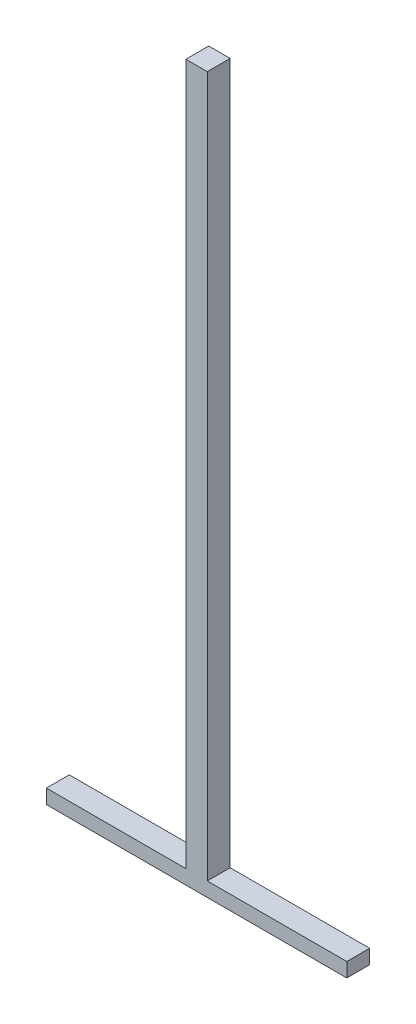
ISO-10303-21;
HEADER;
FILE_DESCRIPTION(('STEP AP214'),'2;1');
FILE_NAME('part.step','',(''),(''),'','','');
FILE_SCHEMA(('AUTOMOTIVE_DESIGN { 1 0 10303 214 1 1 1 1 }'));
ENDSEC;
DATA;
#1=APPLICATION_CONTEXT('core data for automotive mechanical design processes');
#2=APPLICATION_PROTOCOL_DEFINITION('international standard','automotive_design',2000,#1);
#3=PRODUCT_CONTEXT('',#1,'mechanical');
#4=PRODUCT('Part','Part','',(#3));
#5=PRODUCT_RELATED_PRODUCT_CATEGORY('part','',(#4));
#6=PRODUCT_DEFINITION_FORMATION('','',#4);
#7=PRODUCT_DEFINITION_CONTEXT('part definition',#1,'design');
#8=PRODUCT_DEFINITION('design','',#6,#7);
#9=PRODUCT_DEFINITION_SHAPE('','',#8);
#10=(LENGTH_UNIT() NAMED_UNIT(*) SI_UNIT(.MILLI.,.METRE.));
#11=(NAMED_UNIT(*) PLANE_ANGLE_UNIT() SI_UNIT($,.RADIAN.));
#12=(NAMED_UNIT(*) SI_UNIT($,.STERADIAN.) SOLID_ANGLE_UNIT());
#13=UNCERTAINTY_MEASURE_WITH_UNIT(LENGTH_MEASURE(1.E-05),#10,'distance_accuracy_value','');
#14=(GEOMETRIC_REPRESENTATION_CONTEXT(3) GLOBAL_UNCERTAINTY_ASSIGNED_CONTEXT((#13)) GLOBAL_UNIT_ASSIGNED_CONTEXT((#10,
#11,#12)) REPRESENTATION_CONTEXT('',''));
#15=CARTESIAN_POINT('',(0.,0.,0.));
#16=DIRECTION('',(0.,0.,1.));
#17=DIRECTION('',(1.,0.,0.));
#18=AXIS2_PLACEMENT_3D('',#15,#16,#17);
#19=CARTESIAN_POINT('',(-49.1204304742417,100.,19.5828312396976));
#20=DIRECTION('',(1.,0.,0.));
#21=DIRECTION('',(0.,0.,-1.));
#22=AXIS2_PLACEMENT_3D('',#19,#20,#21);
#23=PLANE('',#22);
#24=DIRECTION('',(0.,-1.,0.));
#25=VECTOR('',#24,1.);
#26=CARTESIAN_POINT('',(-49.1204304742417,100.,22.7828312396976));
#27=LINE('',#26,#25);
#28=CARTESIAN_POINT('',(-49.1204304742417,2.,22.7828312396976));
#29=VERTEX_POINT('',#28);
#30=CARTESIAN_POINT('',(-49.1204304742417,0.,22.7828312396976));
#31=VERTEX_POINT('',#30);
#32=EDGE_CURVE('E11',#29,#31,#27,.T.);
#33=ORIENTED_EDGE('',*,*,#32,.F.);
#34=DIRECTION('',(0.,0.,-1.));
#35=VECTOR('',#34,1.);
#36=CARTESIAN_POINT('',(-49.1204304742417,2.,22.7828312396976));
#37=LINE('',#36,#35);
#38=CARTESIAN_POINT('',(-49.1204304742417,2.,19.5828312396976));
#39=VERTEX_POINT('',#38);
#40=EDGE_CURVE('E137',#29,#39,#37,.T.);
#41=ORIENTED_EDGE('',*,*,#40,.T.);
#42=DIRECTION('',(0.,-1.,0.));
#43=VECTOR('',#42,1.);
#44=CARTESIAN_POINT('',(-49.1204304742417,100.,19.5828312396976));
#45=LINE('',#44,#43);
#46=CARTESIAN_POINT('',(-49.1204304742417,0.,19.5828312396976));
#47=VERTEX_POINT('',#46);
#48=EDGE_CURVE('E122',#39,#47,#45,.T.);
#49=ORIENTED_EDGE('',*,*,#48,.T.);
#50=DIRECTION('',(0.,0.,1.));
#51=VECTOR('',#50,1.);
#52=CARTESIAN_POINT('',(-49.1204304742417,0.,19.5828312396976));
#53=LINE('',#52,#51);
#54=EDGE_CURVE('E134',#47,#31,#53,.T.);
#55=ORIENTED_EDGE('',*,*,#54,.T.);
#56=EDGE_LOOP('',(#33,#41,#49,#55));
#57=FACE_BOUND('',#56,.T.);
#58=ADVANCED_FACE('F35',(#57),#23,.F.);
#59=CARTESIAN_POINT('',(-49.1204304742417,100.,22.7828312396976));
#60=DIRECTION('',(0.,0.,-1.));
#61=DIRECTION('',(-1.,0.,0.));
#62=AXIS2_PLACEMENT_3D('',#59,#60,#61);
#63=PLANE('',#62);
#64=DIRECTION('',(-1.,0.,0.));
#65=VECTOR('',#64,1.);
#66=CARTESIAN_POINT('',(-7.12043047424166,2.,22.7828312396976));
#67=LINE('',#66,#65);
#68=CARTESIAN_POINT('',(-7.12043047424166,2.,22.7828312396976));
#69=VERTEX_POINT('',#68);
#70=CARTESIAN_POINT('',(-26.6204304742417,2.,22.7828312396976));
#71=VERTEX_POINT('',#70);
#72=EDGE_CURVE('E98',#69,#71,#67,.T.);
#73=ORIENTED_EDGE('',*,*,#72,.T.);
#74=DIRECTION('',(0.,1.,0.));
#75=VECTOR('',#74,1.);
#76=CARTESIAN_POINT('',(-26.6204304742417,100.,22.7828312396976));
#77=LINE('',#76,#75);
#78=CARTESIAN_POINT('',(-26.6204304742417,100.,22.7828312396976));
#79=VERTEX_POINT('',#78);
#80=EDGE_CURVE('E109',#71,#79,#77,.T.);
#81=ORIENTED_EDGE('',*,*,#80,.T.);
#82=DIRECTION('',(1.,0.,0.));
#83=VECTOR('',#82,1.);
#84=CARTESIAN_POINT('',(-49.1204304742417,100.,22.7828312396976));
#85=LINE('',#84,#83);
#86=CARTESIAN_POINT('',(-29.6204304742417,100.,22.7828312396976));
#87=VERTEX_POINT('',#86);
#88=EDGE_CURVE('E130',#87,#79,#85,.T.);
#89=ORIENTED_EDGE('',*,*,#88,.F.);
#90=DIRECTION('',(0.,-1.,0.));
#91=VECTOR('',#90,1.);
#92=CARTESIAN_POINT('',(-29.6204304742417,100.,22.7828312396976));
#93=LINE('',#92,#91);
#94=CARTESIAN_POINT('',(-29.6204304742417,2.,22.7828312396976));
#95=VERTEX_POINT('',#94);
#96=EDGE_CURVE('E57',#87,#95,#93,.T.);
#97=ORIENTED_EDGE('',*,*,#96,.T.);
#98=DIRECTION('',(-1.,0.,0.));
#99=VECTOR('',#98,1.);
#100=CARTESIAN_POINT('',(-49.1204304742417,2.,22.7828312396976));
#101=LINE('',#100,#99);
#102=EDGE_CURVE('E144',#95,#29,#101,.T.);
#103=ORIENTED_EDGE('',*,*,#102,.T.);
#104=ORIENTED_EDGE('',*,*,#32,.T.);
#105=DIRECTION('',(1.,0.,0.));
#106=VECTOR('',#105,1.);
#107=CARTESIAN_POINT('',(-49.1204304742417,0.,22.7828312396976));
#108=LINE('',#107,#106);
#109=CARTESIAN_POINT('',(-7.12043047424166,0.,22.7828312396976));
#110=VERTEX_POINT('',#109);
#111=EDGE_CURVE('E120',#31,#110,#108,.T.);
#112=ORIENTED_EDGE('',*,*,#111,.T.);
#113=DIRECTION('',(0.,-1.,0.));
#114=VECTOR('',#113,1.);
#115=CARTESIAN_POINT('',(-7.12043047424166,100.,22.7828312396976));
#116=LINE('',#115,#114);
#117=EDGE_CURVE('E42',#69,#110,#116,.T.);
#118=ORIENTED_EDGE('',*,*,#117,.F.);
#119=EDGE_LOOP('',(#73,#81,#89,#97,#103,#104,#112,#118));
#120=FACE_BOUND('',#119,.T.);
#121=ADVANCED_FACE('F118',(#120),#63,.F.);
#122=CARTESIAN_POINT('',(-7.12043047424166,100.,19.5828312396976));
#123=DIRECTION('',(-1.,0.,0.));
#124=DIRECTION('',(0.,0.,1.));
#125=AXIS2_PLACEMENT_3D('',#122,#123,#124);
#126=PLANE('',#125);
#127=DIRECTION('',(0.,-1.,0.));
#128=VECTOR('',#127,1.);
#129=CARTESIAN_POINT('',(-7.12043047424166,100.,19.5828312396976));
#130=LINE('',#129,#128);
#131=CARTESIAN_POINT('',(-7.12043047424166,2.,19.5828312396976));
#132=VERTEX_POINT('',#131);
#133=CARTESIAN_POINT('',(-7.12043047424166,0.,19.5828312396976));
#134=VERTEX_POINT('',#133);
#135=EDGE_CURVE('E116',#132,#134,#130,.T.);
#136=ORIENTED_EDGE('',*,*,#135,.F.);
#137=DIRECTION('',(0.,0.,-1.));
#138=VECTOR('',#137,1.);
#139=CARTESIAN_POINT('',(-7.12043047424166,2.,22.7828312396976));
#140=LINE('',#139,#138);
#141=EDGE_CURVE('E102',#69,#132,#140,.T.);
#142=ORIENTED_EDGE('',*,*,#141,.F.);
#143=ORIENTED_EDGE('',*,*,#117,.T.);
#144=DIRECTION('',(0.,0.,-1.));
#145=VECTOR('',#144,1.);
#146=CARTESIAN_POINT('',(-7.12043047424166,0.,19.5828312396976));
#147=LINE('',#146,#145);
#148=EDGE_CURVE('E131',#110,#134,#147,.T.);
#149=ORIENTED_EDGE('',*,*,#148,.T.);
#150=EDGE_LOOP('',(#136,#142,#143,#149));
#151=FACE_BOUND('',#150,.T.);
#152=ADVANCED_FACE('F113',(#151),#126,.F.);
#153=CARTESIAN_POINT('',(-49.1204304742417,100.,19.5828312396976));
#154=DIRECTION('',(0.,0.,1.));
#155=DIRECTION('',(1.,0.,0.));
#156=AXIS2_PLACEMENT_3D('',#153,#154,#155);
#157=PLANE('',#156);
#158=DIRECTION('',(-1.,0.,0.));
#159=VECTOR('',#158,1.);
#160=CARTESIAN_POINT('',(-49.1204304742417,100.,19.5828312396976));
#161=LINE('',#160,#159);
#162=CARTESIAN_POINT('',(-26.6204304742417,100.,19.5828312396976));
#163=VERTEX_POINT('',#162);
#164=CARTESIAN_POINT('',(-29.6204304742417,100.,19.5828312396976));
#165=VERTEX_POINT('',#164);
#166=EDGE_CURVE('E126',#163,#165,#161,.T.);
#167=ORIENTED_EDGE('',*,*,#166,.F.);
#168=DIRECTION('',(0.,1.,0.));
#169=VECTOR('',#168,1.);
#170=CARTESIAN_POINT('',(-26.6204304742417,100.,19.5828312396976));
#171=LINE('',#170,#169);
#172=CARTESIAN_POINT('',(-26.6204304742417,2.,19.5828312396976));
#173=VERTEX_POINT('',#172);
#174=EDGE_CURVE('E49',#173,#163,#171,.T.);
#175=ORIENTED_EDGE('',*,*,#174,.F.);
#176=DIRECTION('',(-1.,0.,0.));
#177=VECTOR('',#176,1.);
#178=CARTESIAN_POINT('',(-7.12043047424166,2.,19.5828312396976));
#179=LINE('',#178,#177);
#180=EDGE_CURVE('E160',#132,#173,#179,.T.);
#181=ORIENTED_EDGE('',*,*,#180,.F.);
#182=ORIENTED_EDGE('',*,*,#135,.T.);
#183=DIRECTION('',(-1.,0.,0.));
#184=VECTOR('',#183,1.);
#185=CARTESIAN_POINT('',(-49.1204304742417,0.,19.5828312396976));
#186=LINE('',#185,#184);
#187=EDGE_CURVE('E127',#134,#47,#186,.T.);
#188=ORIENTED_EDGE('',*,*,#187,.T.);
#189=ORIENTED_EDGE('',*,*,#48,.F.);
#190=DIRECTION('',(-1.,0.,0.));
#191=VECTOR('',#190,1.);
#192=CARTESIAN_POINT('',(-49.1204304742417,2.,19.5828312396976));
#193=LINE('',#192,#191);
#194=CARTESIAN_POINT('',(-29.6204304742417,2.,19.5828312396976));
#195=VERTEX_POINT('',#194);
#196=EDGE_CURVE('E148',#195,#39,#193,.T.);
#197=ORIENTED_EDGE('',*,*,#196,.F.);
#198=DIRECTION('',(0.,-1.,0.));
#199=VECTOR('',#198,1.);
#200=CARTESIAN_POINT('',(-29.6204304742417,100.,19.5828312396976));
#201=LINE('',#200,#199);
#202=EDGE_CURVE('E150',#165,#195,#201,.T.);
#203=ORIENTED_EDGE('',*,*,#202,.F.);
#204=EDGE_LOOP('',(#167,#175,#181,#182,#188,#189,#197,#203));
#205=FACE_BOUND('',#204,.T.);
#206=ADVANCED_FACE('F170',(#205),#157,.F.);
#207=CARTESIAN_POINT('',(0.,100.,0.));
#208=DIRECTION('',(0.,1.,0.));
#209=DIRECTION('',(0.,0.,1.));
#210=AXIS2_PLACEMENT_3D('',#207,#208,#209);
#211=PLANE('',#210);
#212=DIRECTION('',(0.,0.,-1.));
#213=VECTOR('',#212,1.);
#214=CARTESIAN_POINT('',(-26.6204304742417,100.,22.7828312396976));
#215=LINE('',#214,#213);
#216=EDGE_CURVE('E153',#79,#163,#215,.T.);
#217=ORIENTED_EDGE('',*,*,#216,.T.);
#218=ORIENTED_EDGE('',*,*,#166,.T.);
#219=DIRECTION('',(0.,0.,-1.));
#220=VECTOR('',#219,1.);
#221=CARTESIAN_POINT('',(-29.6204304742417,100.,22.7828312396976));
#222=LINE('',#221,#220);
#223=EDGE_CURVE('E141',#87,#165,#222,.T.);
#224=ORIENTED_EDGE('',*,*,#223,.F.);
#225=ORIENTED_EDGE('',*,*,#88,.T.);
#226=EDGE_LOOP('',(#217,#218,#224,#225));
#227=FACE_BOUND('',#226,.T.);
#228=ADVANCED_FACE('F164',(#227),#211,.T.);
#229=CARTESIAN_POINT('',(0.,0.,0.));
#230=DIRECTION('',(0.,1.,0.));
#231=DIRECTION('',(0.,0.,1.));
#232=AXIS2_PLACEMENT_3D('',#229,#230,#231);
#233=PLANE('',#232);
#234=ORIENTED_EDGE('',*,*,#54,.F.);
#235=ORIENTED_EDGE('',*,*,#187,.F.);
#236=ORIENTED_EDGE('',*,*,#148,.F.);
#237=ORIENTED_EDGE('',*,*,#111,.F.);
#238=EDGE_LOOP('',(#234,#235,#236,#237));
#239=FACE_BOUND('',#238,.T.);
#240=ADVANCED_FACE('F179',(#239),#233,.F.);
#241=CARTESIAN_POINT('',(-49.1204304742417,2.,22.7828312396976));
#242=DIRECTION('',(0.,-1.,0.));
#243=DIRECTION('',(1.,0.,0.));
#244=AXIS2_PLACEMENT_3D('',#241,#242,#243);
#245=PLANE('',#244);
#246=ORIENTED_EDGE('',*,*,#196,.T.);
#247=ORIENTED_EDGE('',*,*,#40,.F.);
#248=ORIENTED_EDGE('',*,*,#102,.F.);
#249=DIRECTION('',(0.,0.,-1.));
#250=VECTOR('',#249,1.);
#251=CARTESIAN_POINT('',(-29.6204304742417,2.,22.7828312396976));
#252=LINE('',#251,#250);
#253=EDGE_CURVE('E143',#95,#195,#252,.T.);
#254=ORIENTED_EDGE('',*,*,#253,.T.);
#255=EDGE_LOOP('',(#246,#247,#248,#254));
#256=FACE_BOUND('',#255,.T.);
#257=ADVANCED_FACE('F173',(#256),#245,.F.);
#258=CARTESIAN_POINT('',(-29.6204304742417,100.,22.7828312396976));
#259=DIRECTION('',(1.,0.,0.));
#260=DIRECTION('',(0.,1.,0.));
#261=AXIS2_PLACEMENT_3D('',#258,#259,#260);
#262=PLANE('',#261);
#263=ORIENTED_EDGE('',*,*,#202,.T.);
#264=ORIENTED_EDGE('',*,*,#253,.F.);
#265=ORIENTED_EDGE('',*,*,#96,.F.);
#266=ORIENTED_EDGE('',*,*,#223,.T.);
#267=EDGE_LOOP('',(#263,#264,#265,#266));
#268=FACE_BOUND('',#267,.T.);
#269=ADVANCED_FACE('F167',(#268),#262,.F.);
#270=CARTESIAN_POINT('',(-26.6204304742417,100.,22.7828312396976));
#271=DIRECTION('',(-1.,0.,0.));
#272=DIRECTION('',(0.,-1.,0.));
#273=AXIS2_PLACEMENT_3D('',#270,#271,#272);
#274=PLANE('',#273);
#275=ORIENTED_EDGE('',*,*,#174,.T.);
#276=ORIENTED_EDGE('',*,*,#216,.F.);
#277=ORIENTED_EDGE('',*,*,#80,.F.);
#278=DIRECTION('',(0.,0.,-1.));
#279=VECTOR('',#278,1.);
#280=CARTESIAN_POINT('',(-26.6204304742417,2.,22.7828312396976));
#281=LINE('',#280,#279);
#282=EDGE_CURVE('E104',#71,#173,#281,.T.);
#283=ORIENTED_EDGE('',*,*,#282,.T.);
#284=EDGE_LOOP('',(#275,#276,#277,#283));
#285=FACE_BOUND('',#284,.T.);
#286=ADVANCED_FACE('F223',(#285),#274,.F.);
#287=CARTESIAN_POINT('',(-7.12043047424166,2.,22.7828312396976));
#288=DIRECTION('',(0.,-1.,0.));
#289=DIRECTION('',(0.,0.,-1.));
#290=AXIS2_PLACEMENT_3D('',#287,#288,#289);
#291=PLANE('',#290);
#292=ORIENTED_EDGE('',*,*,#180,.T.);
#293=ORIENTED_EDGE('',*,*,#282,.F.);
#294=ORIENTED_EDGE('',*,*,#72,.F.);
#295=ORIENTED_EDGE('',*,*,#141,.T.);
#296=EDGE_LOOP('',(#292,#293,#294,#295));
#297=FACE_BOUND('',#296,.T.);
#298=ADVANCED_FACE('F101',(#297),#291,.F.);
#299=CLOSED_SHELL('',(#58,#121,#152,#206,#228,#240,#257,#269,#286,#298));
#300=MANIFOLD_SOLID_BREP('B2',#299);
#301=ADVANCED_BREP_SHAPE_REPRESENTATION('',(#18,#300),#14);
#302=SHAPE_DEFINITION_REPRESENTATION(#9,#301);
ENDSEC;
END-ISO-10303-21;
